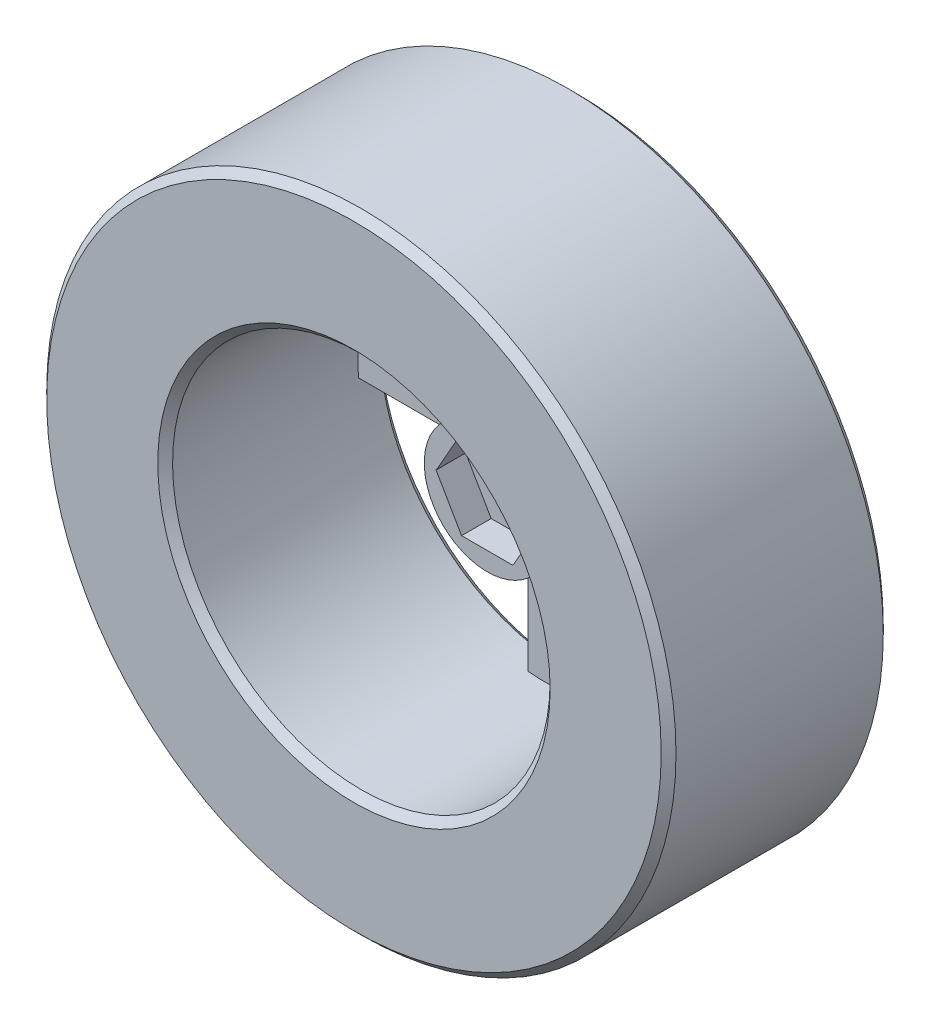
ISO-10303-21;
HEADER;
FILE_DESCRIPTION(('STEP AP214'),'2;1');
FILE_NAME('part.step','',(''),(''),'','','');
FILE_SCHEMA(('AUTOMOTIVE_DESIGN { 1 0 10303 214 1 1 1 1 }'));
ENDSEC;
DATA;
#1=APPLICATION_CONTEXT('core data for automotive mechanical design processes');
#2=APPLICATION_PROTOCOL_DEFINITION('international standard','automotive_design',2000,#1);
#3=PRODUCT_CONTEXT('',#1,'mechanical');
#4=PRODUCT('Part','Part','',(#3));
#5=PRODUCT_RELATED_PRODUCT_CATEGORY('part','',(#4));
#6=PRODUCT_DEFINITION_FORMATION('','',#4);
#7=PRODUCT_DEFINITION_CONTEXT('part definition',#1,'design');
#8=PRODUCT_DEFINITION('design','',#6,#7);
#9=PRODUCT_DEFINITION_SHAPE('','',#8);
#10=(LENGTH_UNIT() NAMED_UNIT(*) SI_UNIT(.MILLI.,.METRE.));
#11=(NAMED_UNIT(*) PLANE_ANGLE_UNIT() SI_UNIT($,.RADIAN.));
#12=(NAMED_UNIT(*) SI_UNIT($,.STERADIAN.) SOLID_ANGLE_UNIT());
#13=UNCERTAINTY_MEASURE_WITH_UNIT(LENGTH_MEASURE(1.E-05),#10,'distance_accuracy_value','');
#14=(GEOMETRIC_REPRESENTATION_CONTEXT(3) GLOBAL_UNCERTAINTY_ASSIGNED_CONTEXT((#13)) GLOBAL_UNIT_ASSIGNED_CONTEXT((#10,
#11,#12)) REPRESENTATION_CONTEXT('',''));
#15=CARTESIAN_POINT('',(0.,0.,0.));
#16=DIRECTION('',(0.,0.,1.));
#17=DIRECTION('',(1.,0.,0.));
#18=AXIS2_PLACEMENT_3D('',#15,#16,#17);
#19=CARTESIAN_POINT('',(0.,0.,0.));
#20=DIRECTION('',(0.,0.,1.));
#21=DIRECTION('',(1.,0.,0.));
#22=AXIS2_PLACEMENT_3D('',#19,#20,#21);
#23=PLANE('',#22);
#24=CARTESIAN_POINT('',(0.,0.,0.));
#25=DIRECTION('',(0.,0.,1.));
#26=DIRECTION('',(1.,0.,0.));
#27=AXIS2_PLACEMENT_3D('',#24,#25,#26);
#28=CIRCLE('',#27,41.5);
#29=CARTESIAN_POINT('',(41.5,0.,0.));
#30=VERTEX_POINT('',#29);
#31=EDGE_CURVE('E11',#30,#30,#28,.F.);
#32=ORIENTED_EDGE('',*,*,#31,.T.);
#33=EDGE_LOOP('',(#32));
#34=FACE_BOUND('',#33,.T.);
#35=CARTESIAN_POINT('',(0.,0.,0.));
#36=DIRECTION('',(0.,0.,1.));
#37=DIRECTION('',(1.,0.,0.));
#38=AXIS2_PLACEMENT_3D('',#35,#36,#37);
#39=CIRCLE('',#38,26.5);
#40=CARTESIAN_POINT('',(-26.3818119165458,-2.49999999999999,0.));
#41=VERTEX_POINT('',#40);
#42=CARTESIAN_POINT('',(-2.49999999999998,-26.3818119165458,0.));
#43=VERTEX_POINT('',#42);
#44=EDGE_CURVE('E403',#41,#43,#39,.T.);
#45=ORIENTED_EDGE('',*,*,#44,.T.);
#46=DIRECTION('',(0.,-1.,0.));
#47=VECTOR('',#46,1.);
#48=CARTESIAN_POINT('',(-2.49999999999999,0.,0.));
#49=LINE('',#48,#47);
#50=CARTESIAN_POINT('',(-2.49999999999999,-8.12403840463596,0.));
#51=VERTEX_POINT('',#50);
#52=EDGE_CURVE('E313',#51,#43,#49,.T.);
#53=ORIENTED_EDGE('',*,*,#52,.F.);
#54=CARTESIAN_POINT('',(0.,0.,0.));
#55=DIRECTION('',(0.,0.,1.));
#56=DIRECTION('',(1.,0.,0.));
#57=AXIS2_PLACEMENT_3D('',#54,#55,#56);
#58=CIRCLE('',#57,8.5);
#59=CARTESIAN_POINT('',(-8.12403840463596,-2.49999999999999,0.));
#60=VERTEX_POINT('',#59);
#61=EDGE_CURVE('E601',#60,#51,#58,.T.);
#62=ORIENTED_EDGE('',*,*,#61,.F.);
#63=DIRECTION('',(-1.,0.,0.));
#64=VECTOR('',#63,1.);
#65=CARTESIAN_POINT('',(0.,-2.49999999999999,0.));
#66=LINE('',#65,#64);
#67=EDGE_CURVE('E292',#60,#41,#66,.T.);
#68=ORIENTED_EDGE('',*,*,#67,.T.);
#69=EDGE_LOOP('',(#45,#53,#62,#68));
#70=FACE_BOUND('',#69,.T.);
#71=CARTESIAN_POINT('',(0.,0.,0.));
#72=DIRECTION('',(0.,0.,1.));
#73=DIRECTION('',(1.,0.,0.));
#74=AXIS2_PLACEMENT_3D('',#71,#72,#73);
#75=CIRCLE('',#74,26.5);
#76=CARTESIAN_POINT('',(2.5,-26.3818119165458,0.));
#77=VERTEX_POINT('',#76);
#78=CARTESIAN_POINT('',(26.3818119165458,-2.49999999999999,0.));
#79=VERTEX_POINT('',#78);
#80=EDGE_CURVE('E406',#77,#79,#75,.T.);
#81=ORIENTED_EDGE('',*,*,#80,.T.);
#82=DIRECTION('',(-1.,0.,0.));
#83=VECTOR('',#82,1.);
#84=CARTESIAN_POINT('',(0.,-2.49999999999999,0.));
#85=LINE('',#84,#83);
#86=CARTESIAN_POINT('',(8.12403840463596,-2.49999999999999,0.));
#87=VERTEX_POINT('',#86);
#88=EDGE_CURVE('E337',#79,#87,#85,.T.);
#89=ORIENTED_EDGE('',*,*,#88,.T.);
#90=CARTESIAN_POINT('',(2.5,-8.12403840463596,0.));
#91=VERTEX_POINT('',#90);
#92=EDGE_CURVE('E272',#91,#87,#58,.T.);
#93=ORIENTED_EDGE('',*,*,#92,.F.);
#94=DIRECTION('',(0.,-1.,0.));
#95=VECTOR('',#94,1.);
#96=CARTESIAN_POINT('',(2.5,0.,0.));
#97=LINE('',#96,#95);
#98=EDGE_CURVE('E317',#91,#77,#97,.T.);
#99=ORIENTED_EDGE('',*,*,#98,.T.);
#100=EDGE_LOOP('',(#81,#89,#93,#99));
#101=FACE_BOUND('',#100,.T.);
#102=CARTESIAN_POINT('',(0.,0.,0.));
#103=DIRECTION('',(0.,0.,1.));
#104=DIRECTION('',(1.,0.,0.));
#105=AXIS2_PLACEMENT_3D('',#102,#103,#104);
#106=CIRCLE('',#105,26.5);
#107=CARTESIAN_POINT('',(26.3818119165458,2.5,0.));
#108=VERTEX_POINT('',#107);
#109=CARTESIAN_POINT('',(2.5,26.3818119165458,0.));
#110=VERTEX_POINT('',#109);
#111=EDGE_CURVE('E400',#108,#110,#106,.T.);
#112=ORIENTED_EDGE('',*,*,#111,.T.);
#113=DIRECTION('',(0.,-1.,0.));
#114=VECTOR('',#113,1.);
#115=CARTESIAN_POINT('',(2.5,0.,0.));
#116=LINE('',#115,#114);
#117=CARTESIAN_POINT('',(2.5,8.12403840463596,0.));
#118=VERTEX_POINT('',#117);
#119=EDGE_CURVE('E363',#110,#118,#116,.T.);
#120=ORIENTED_EDGE('',*,*,#119,.T.);
#121=CARTESIAN_POINT('',(8.12403840463596,2.5,0.));
#122=VERTEX_POINT('',#121);
#123=EDGE_CURVE('E286',#122,#118,#58,.T.);
#124=ORIENTED_EDGE('',*,*,#123,.F.);
#125=DIRECTION('',(1.,0.,0.));
#126=VECTOR('',#125,1.);
#127=CARTESIAN_POINT('',(0.,2.5,0.));
#128=LINE('',#127,#126);
#129=EDGE_CURVE('E341',#122,#108,#128,.T.);
#130=ORIENTED_EDGE('',*,*,#129,.T.);
#131=EDGE_LOOP('',(#112,#120,#124,#130));
#132=FACE_BOUND('',#131,.T.);
#133=CARTESIAN_POINT('',(0.,0.,0.));
#134=DIRECTION('',(0.,0.,1.));
#135=DIRECTION('',(1.,0.,0.));
#136=AXIS2_PLACEMENT_3D('',#133,#134,#135);
#137=CIRCLE('',#136,26.5);
#138=CARTESIAN_POINT('',(-2.49999999999999,26.3818119165458,0.));
#139=VERTEX_POINT('',#138);
#140=CARTESIAN_POINT('',(-26.3818119165458,2.5,0.));
#141=VERTEX_POINT('',#140);
#142=EDGE_CURVE('E397',#139,#141,#137,.T.);
#143=ORIENTED_EDGE('',*,*,#142,.T.);
#144=DIRECTION('',(1.,0.,0.));
#145=VECTOR('',#144,1.);
#146=CARTESIAN_POINT('',(0.,2.5,0.));
#147=LINE('',#146,#145);
#148=CARTESIAN_POINT('',(-8.12403840463596,2.5,0.));
#149=VERTEX_POINT('',#148);
#150=EDGE_CURVE('E285',#141,#149,#147,.T.);
#151=ORIENTED_EDGE('',*,*,#150,.T.);
#152=CARTESIAN_POINT('',(-2.49999999999999,8.12403840463596,0.));
#153=VERTEX_POINT('',#152);
#154=EDGE_CURVE('E288',#153,#149,#58,.T.);
#155=ORIENTED_EDGE('',*,*,#154,.F.);
#156=DIRECTION('',(0.,-1.,0.));
#157=VECTOR('',#156,1.);
#158=CARTESIAN_POINT('',(-2.49999999999999,0.,0.));
#159=LINE('',#158,#157);
#160=EDGE_CURVE('E368',#139,#153,#159,.T.);
#161=ORIENTED_EDGE('',*,*,#160,.F.);
#162=EDGE_LOOP('',(#143,#151,#155,#161));
#163=FACE_BOUND('',#162,.T.);
#164=ADVANCED_FACE('F34',(#34,#70,#101,#132,#163),#23,.F.);
#165=CARTESIAN_POINT('',(0.,0.,30.));
#166=DIRECTION('',(0.,0.,1.));
#167=DIRECTION('',(1.,0.,0.));
#168=AXIS2_PLACEMENT_3D('',#165,#166,#167);
#169=PLANE('',#168);
#170=CARTESIAN_POINT('',(0.,0.,30.));
#171=DIRECTION('',(0.,0.,1.));
#172=DIRECTION('',(1.,0.,0.));
#173=AXIS2_PLACEMENT_3D('',#170,#171,#172);
#174=CIRCLE('',#173,41.5);
#175=CARTESIAN_POINT('',(41.5,0.,30.));
#176=VERTEX_POINT('',#175);
#177=EDGE_CURVE('E42',#176,#176,#174,.T.);
#178=ORIENTED_EDGE('',*,*,#177,.T.);
#179=EDGE_LOOP('',(#178));
#180=FACE_BOUND('',#179,.T.);
#181=CARTESIAN_POINT('',(0.,0.,30.));
#182=DIRECTION('',(0.,0.,1.));
#183=DIRECTION('',(1.,0.,0.));
#184=AXIS2_PLACEMENT_3D('',#181,#182,#183);
#185=CIRCLE('',#184,26.5);
#186=CARTESIAN_POINT('',(26.5,0.,30.));
#187=VERTEX_POINT('',#186);
#188=EDGE_CURVE('E394',#187,#187,#185,.F.);
#189=ORIENTED_EDGE('',*,*,#188,.T.);
#190=EDGE_LOOP('',(#189));
#191=FACE_BOUND('',#190,.T.);
#192=ADVANCED_FACE('F447',(#180,#191),#169,.T.);
#193=CARTESIAN_POINT('',(0.,0.,30.));
#194=DIRECTION('',(0.,0.,-1.));
#195=DIRECTION('',(-1.,0.,0.));
#196=AXIS2_PLACEMENT_3D('',#193,#194,#195);
#197=CYLINDRICAL_SURFACE('',#196,25.5);
#198=CARTESIAN_POINT('',(0.,0.,29.));
#199=DIRECTION('',(0.,0.,1.));
#200=DIRECTION('',(1.,0.,0.));
#201=AXIS2_PLACEMENT_3D('',#198,#199,#200);
#202=CIRCLE('',#201,25.5);
#203=CARTESIAN_POINT('',(25.5,0.,29.));
#204=VERTEX_POINT('',#203);
#205=EDGE_CURVE('E391',#204,#204,#202,.T.);
#206=ORIENTED_EDGE('',*,*,#205,.T.);
#207=EDGE_LOOP('',(#206));
#208=FACE_BOUND('',#207,.T.);
#209=DIRECTION('',(0.,0.,-1.));
#210=VECTOR('',#209,1.);
#211=CARTESIAN_POINT('',(25.377155080899,-2.49999999999999,4.));
#212=LINE('',#211,#210);
#213=CARTESIAN_POINT('',(25.377155080899,-2.49999999999999,4.));
#214=VERTEX_POINT('',#213);
#215=CARTESIAN_POINT('',(25.377155080899,-2.49999999999999,1.));
#216=VERTEX_POINT('',#215);
#217=EDGE_CURVE('E360',#214,#216,#212,.T.);
#218=ORIENTED_EDGE('',*,*,#217,.T.);
#219=CARTESIAN_POINT('',(0.,0.,1.));
#220=DIRECTION('',(0.,0.,1.));
#221=DIRECTION('',(1.,0.,0.));
#222=AXIS2_PLACEMENT_3D('',#219,#220,#221);
#223=CIRCLE('',#222,25.5);
#224=CARTESIAN_POINT('',(2.5,-25.377155080899,1.));
#225=VERTEX_POINT('',#224);
#226=EDGE_CURVE('E414',#216,#225,#223,.F.);
#227=ORIENTED_EDGE('',*,*,#226,.T.);
#228=DIRECTION('',(0.,0.,-1.));
#229=VECTOR('',#228,1.);
#230=CARTESIAN_POINT('',(2.5,-25.377155080899,4.));
#231=LINE('',#230,#229);
#232=CARTESIAN_POINT('',(2.5,-25.377155080899,4.));
#233=VERTEX_POINT('',#232);
#234=EDGE_CURVE('E332',#233,#225,#231,.T.);
#235=ORIENTED_EDGE('',*,*,#234,.F.);
#236=CARTESIAN_POINT('',(0.,0.,4.));
#237=DIRECTION('',(0.,0.,1.));
#238=DIRECTION('',(1.,0.,0.));
#239=AXIS2_PLACEMENT_3D('',#236,#237,#238);
#240=CIRCLE('',#239,25.5);
#241=CARTESIAN_POINT('',(-2.49999999999998,-25.377155080899,4.));
#242=VERTEX_POINT('',#241);
#243=EDGE_CURVE('E316',#242,#233,#240,.T.);
#244=ORIENTED_EDGE('',*,*,#243,.F.);
#245=DIRECTION('',(0.,0.,-1.));
#246=VECTOR('',#245,1.);
#247=CARTESIAN_POINT('',(-2.49999999999998,-25.377155080899,4.));
#248=LINE('',#247,#246);
#249=CARTESIAN_POINT('',(-2.49999999999998,-25.377155080899,1.));
#250=VERTEX_POINT('',#249);
#251=EDGE_CURVE('E335',#242,#250,#248,.T.);
#252=ORIENTED_EDGE('',*,*,#251,.T.);
#253=CARTESIAN_POINT('',(0.,0.,1.));
#254=DIRECTION('',(0.,0.,1.));
#255=DIRECTION('',(1.,0.,0.));
#256=AXIS2_PLACEMENT_3D('',#253,#254,#255);
#257=CIRCLE('',#256,25.5);
#258=CARTESIAN_POINT('',(-25.377155080899,-2.49999999999999,1.));
#259=VERTEX_POINT('',#258);
#260=EDGE_CURVE('E49',#250,#259,#257,.F.);
#261=ORIENTED_EDGE('',*,*,#260,.T.);
#262=DIRECTION('',(0.,0.,-1.));
#263=VECTOR('',#262,1.);
#264=CARTESIAN_POINT('',(-25.377155080899,-2.49999999999999,4.));
#265=LINE('',#264,#263);
#266=CARTESIAN_POINT('',(-25.377155080899,-2.49999999999999,4.));
#267=VERTEX_POINT('',#266);
#268=EDGE_CURVE('E308',#267,#259,#265,.T.);
#269=ORIENTED_EDGE('',*,*,#268,.F.);
#270=CARTESIAN_POINT('',(0.,0.,4.));
#271=DIRECTION('',(0.,0.,1.));
#272=DIRECTION('',(1.,0.,0.));
#273=AXIS2_PLACEMENT_3D('',#270,#271,#272);
#274=CIRCLE('',#273,25.5);
#275=CARTESIAN_POINT('',(-25.377155080899,2.5,4.));
#276=VERTEX_POINT('',#275);
#277=EDGE_CURVE('E291',#276,#267,#274,.T.);
#278=ORIENTED_EDGE('',*,*,#277,.F.);
#279=DIRECTION('',(0.,0.,-1.));
#280=VECTOR('',#279,1.);
#281=CARTESIAN_POINT('',(-25.377155080899,2.5,4.));
#282=LINE('',#281,#280);
#283=CARTESIAN_POINT('',(-25.377155080899,2.5,1.));
#284=VERTEX_POINT('',#283);
#285=EDGE_CURVE('E310',#276,#284,#282,.T.);
#286=ORIENTED_EDGE('',*,*,#285,.T.);
#287=CARTESIAN_POINT('',(0.,0.,1.));
#288=DIRECTION('',(0.,0.,1.));
#289=DIRECTION('',(1.,0.,0.));
#290=AXIS2_PLACEMENT_3D('',#287,#288,#289);
#291=CIRCLE('',#290,25.5);
#292=CARTESIAN_POINT('',(-2.49999999999999,25.377155080899,1.));
#293=VERTEX_POINT('',#292);
#294=EDGE_CURVE('E409',#284,#293,#291,.F.);
#295=ORIENTED_EDGE('',*,*,#294,.T.);
#296=DIRECTION('',(0.,0.,-1.));
#297=VECTOR('',#296,1.);
#298=CARTESIAN_POINT('',(-2.49999999999999,25.377155080899,4.));
#299=LINE('',#298,#297);
#300=CARTESIAN_POINT('',(-2.49999999999999,25.377155080899,4.));
#301=VERTEX_POINT('',#300);
#302=EDGE_CURVE('E385',#301,#293,#299,.T.);
#303=ORIENTED_EDGE('',*,*,#302,.F.);
#304=CARTESIAN_POINT('',(0.,0.,4.));
#305=DIRECTION('',(0.,0.,1.));
#306=DIRECTION('',(1.,0.,0.));
#307=AXIS2_PLACEMENT_3D('',#304,#305,#306);
#308=CIRCLE('',#307,25.5);
#309=CARTESIAN_POINT('',(2.5,25.377155080899,4.));
#310=VERTEX_POINT('',#309);
#311=EDGE_CURVE('E367',#310,#301,#308,.T.);
#312=ORIENTED_EDGE('',*,*,#311,.F.);
#313=DIRECTION('',(0.,0.,-1.));
#314=VECTOR('',#313,1.);
#315=CARTESIAN_POINT('',(2.5,25.377155080899,4.));
#316=LINE('',#315,#314);
#317=CARTESIAN_POINT('',(2.5,25.377155080899,1.));
#318=VERTEX_POINT('',#317);
#319=EDGE_CURVE('E388',#310,#318,#316,.T.);
#320=ORIENTED_EDGE('',*,*,#319,.T.);
#321=CARTESIAN_POINT('',(0.,0.,1.));
#322=DIRECTION('',(0.,0.,1.));
#323=DIRECTION('',(1.,0.,0.));
#324=AXIS2_PLACEMENT_3D('',#321,#322,#323);
#325=CIRCLE('',#324,25.5);
#326=CARTESIAN_POINT('',(25.377155080899,2.5,1.));
#327=VERTEX_POINT('',#326);
#328=EDGE_CURVE('E411',#318,#327,#325,.F.);
#329=ORIENTED_EDGE('',*,*,#328,.T.);
#330=DIRECTION('',(0.,0.,-1.));
#331=VECTOR('',#330,1.);
#332=CARTESIAN_POINT('',(25.377155080899,2.5,4.));
#333=LINE('',#332,#331);
#334=CARTESIAN_POINT('',(25.377155080899,2.5,4.));
#335=VERTEX_POINT('',#334);
#336=EDGE_CURVE('E357',#335,#327,#333,.T.);
#337=ORIENTED_EDGE('',*,*,#336,.F.);
#338=CARTESIAN_POINT('',(0.,0.,4.));
#339=DIRECTION('',(0.,0.,1.));
#340=DIRECTION('',(1.,0.,0.));
#341=AXIS2_PLACEMENT_3D('',#338,#339,#340);
#342=CIRCLE('',#341,25.5);
#343=EDGE_CURVE('E340',#214,#335,#342,.T.);
#344=ORIENTED_EDGE('',*,*,#343,.F.);
#345=EDGE_LOOP('',(#218,#227,#235,#244,#252,#261,#269,#278,#286,#295,#303,#312,#320,#329,#337,#344));
#346=FACE_BOUND('',#345,.T.);
#347=ADVANCED_FACE('F443',(#208,#346),#197,.F.);
#348=CARTESIAN_POINT('',(2.5,0.,4.));
#349=DIRECTION('',(1.,0.,0.));
#350=DIRECTION('',(0.,1.,0.));
#351=AXIS2_PLACEMENT_3D('',#348,#349,#350);
#352=PLANE('',#351);
#353=ORIENTED_EDGE('',*,*,#119,.F.);
#354=CARTESIAN_POINT('',(2.5,26.3818119165458,0.));
#355=CARTESIAN_POINT('',(2.5,26.2143840709584,0.166681696675359));
#356=CARTESIAN_POINT('',(2.5,26.0469487451974,0.333355878343144));
#357=CARTESIAN_POINT('',(2.5,25.7120631333152,0.66668921167648));
#358=CARTESIAN_POINT('',(2.5,25.5446128471939,0.83334836334203));
#359=CARTESIAN_POINT('',(2.5,25.377155080899,1.));
#360=B_SPLINE_CURVE_WITH_KNOTS('',3,(#354,#355,#356,#357,#358,#359),.UNSPECIFIED.,.F.,.F.,(4,2,
4),(0.,0.708755134250108,1.41751026855513),.UNSPECIFIED.);
#361=EDGE_CURVE('E530',#110,#318,#360,.T.);
#362=ORIENTED_EDGE('',*,*,#361,.T.);
#363=ORIENTED_EDGE('',*,*,#319,.F.);
#364=DIRECTION('',(0.,-1.,0.));
#365=VECTOR('',#364,1.);
#366=CARTESIAN_POINT('',(2.5,0.,4.));
#367=LINE('',#366,#365);
#368=CARTESIAN_POINT('',(2.5,8.12403840463596,4.));
#369=VERTEX_POINT('',#368);
#370=EDGE_CURVE('E364',#310,#369,#367,.T.);
#371=ORIENTED_EDGE('',*,*,#370,.T.);
#372=DIRECTION('',(0.,0.,-1.));
#373=VECTOR('',#372,1.);
#374=CARTESIAN_POINT('',(2.5,8.12403840463596,4.));
#375=LINE('',#374,#373);
#376=EDGE_CURVE('E375',#369,#118,#375,.T.);
#377=ORIENTED_EDGE('',*,*,#376,.T.);
#378=EDGE_LOOP('',(#353,#362,#363,#371,#377));
#379=FACE_BOUND('',#378,.T.);
#380=ADVANCED_FACE('F446',(#379),#352,.T.);
#381=CARTESIAN_POINT('',(-2.49999999999999,0.,4.));
#382=DIRECTION('',(1.,0.,0.));
#383=DIRECTION('',(0.,1.,0.));
#384=AXIS2_PLACEMENT_3D('',#381,#382,#383);
#385=PLANE('',#384);
#386=ORIENTED_EDGE('',*,*,#160,.T.);
#387=DIRECTION('',(0.,0.,-1.));
#388=VECTOR('',#387,1.);
#389=CARTESIAN_POINT('',(-2.49999999999999,8.12403840463596,4.));
#390=LINE('',#389,#388);
#391=CARTESIAN_POINT('',(-2.49999999999999,8.12403840463596,4.));
#392=VERTEX_POINT('',#391);
#393=EDGE_CURVE('E382',#392,#153,#390,.T.);
#394=ORIENTED_EDGE('',*,*,#393,.F.);
#395=DIRECTION('',(0.,-1.,0.));
#396=VECTOR('',#395,1.);
#397=CARTESIAN_POINT('',(-2.49999999999999,0.,4.));
#398=LINE('',#397,#396);
#399=EDGE_CURVE('E370',#301,#392,#398,.T.);
#400=ORIENTED_EDGE('',*,*,#399,.F.);
#401=ORIENTED_EDGE('',*,*,#302,.T.);
#402=CARTESIAN_POINT('',(-2.49999999999999,25.377155080899,1.));
#403=CARTESIAN_POINT('',(-2.49999999999999,25.5446128471939,0.833348363342029));
#404=CARTESIAN_POINT('',(-2.49999999999999,25.7120631333152,0.666689211676479));
#405=CARTESIAN_POINT('',(-2.49999999999999,26.0469487451974,0.333355878343143));
#406=CARTESIAN_POINT('',(-2.49999999999999,26.2143840709584,0.166681696675358));
#407=CARTESIAN_POINT('',(-2.49999999999999,26.3818119165458,0.));
#408=B_SPLINE_CURVE_WITH_KNOTS('',3,(#402,#403,#404,#405,#406,#407),.UNSPECIFIED.,.F.,.F.,(4,2,
4),(0.,0.708755134305022,1.41751026855513),.UNSPECIFIED.);
#409=EDGE_CURVE('E465',#293,#139,#408,.T.);
#410=ORIENTED_EDGE('',*,*,#409,.T.);
#411=EDGE_LOOP('',(#386,#394,#400,#401,#410));
#412=FACE_BOUND('',#411,.T.);
#413=ADVANCED_FACE('F454',(#412),#385,.F.);
#414=CARTESIAN_POINT('',(0.,0.,4.));
#415=DIRECTION('',(0.,0.,1.));
#416=DIRECTION('',(1.,0.,0.));
#417=AXIS2_PLACEMENT_3D('',#414,#415,#416);
#418=PLANE('',#417);
#419=ORIENTED_EDGE('',*,*,#370,.F.);
#420=ORIENTED_EDGE('',*,*,#311,.T.);
#421=ORIENTED_EDGE('',*,*,#399,.T.);
#422=CARTESIAN_POINT('',(0.,0.,4.));
#423=DIRECTION('',(0.,0.,1.));
#424=DIRECTION('',(1.,0.,0.));
#425=AXIS2_PLACEMENT_3D('',#422,#423,#424);
#426=CIRCLE('',#425,8.5);
#427=EDGE_CURVE('E373',#369,#392,#426,.T.);
#428=ORIENTED_EDGE('',*,*,#427,.F.);
#429=EDGE_LOOP('',(#419,#420,#421,#428));
#430=FACE_BOUND('',#429,.T.);
#431=ADVANCED_FACE('F439',(#430),#418,.T.);
#432=CARTESIAN_POINT('',(0.,-2.49999999999999,4.));
#433=DIRECTION('',(0.,-1.,0.));
#434=DIRECTION('',(1.,0.,0.));
#435=AXIS2_PLACEMENT_3D('',#432,#433,#434);
#436=PLANE('',#435);
#437=ORIENTED_EDGE('',*,*,#88,.F.);
#438=CARTESIAN_POINT('',(26.3818119165458,-2.49999999999999,0.));
#439=CARTESIAN_POINT('',(26.2143840709585,-2.49999999999999,0.166681696675359));
#440=CARTESIAN_POINT('',(26.0469487451974,-2.49999999999999,0.333355878343144));
#441=CARTESIAN_POINT('',(25.7120631333152,-2.49999999999999,0.66668921167648));
#442=CARTESIAN_POINT('',(25.5446128471939,-2.49999999999999,0.83334836334203));
#443=CARTESIAN_POINT('',(25.377155080899,-2.49999999999999,1.));
#444=B_SPLINE_CURVE_WITH_KNOTS('',3,(#438,#439,#440,#441,#442,#443),.UNSPECIFIED.,.F.,.F.,(4,2,
4),(0.,0.708755134250114,1.41751026855514),.UNSPECIFIED.);
#445=EDGE_CURVE('E416',#79,#216,#444,.T.);
#446=ORIENTED_EDGE('',*,*,#445,.T.);
#447=ORIENTED_EDGE('',*,*,#217,.F.);
#448=DIRECTION('',(-1.,0.,0.));
#449=VECTOR('',#448,1.);
#450=CARTESIAN_POINT('',(0.,-2.49999999999999,4.));
#451=LINE('',#450,#449);
#452=CARTESIAN_POINT('',(8.12403840463596,-2.49999999999999,4.));
#453=VERTEX_POINT('',#452);
#454=EDGE_CURVE('E338',#214,#453,#451,.T.);
#455=ORIENTED_EDGE('',*,*,#454,.T.);
#456=DIRECTION('',(0.,0.,-1.));
#457=VECTOR('',#456,1.);
#458=CARTESIAN_POINT('',(8.12403840463596,-2.49999999999999,4.));
#459=LINE('',#458,#457);
#460=EDGE_CURVE('E349',#453,#87,#459,.T.);
#461=ORIENTED_EDGE('',*,*,#460,.T.);
#462=EDGE_LOOP('',(#437,#446,#447,#455,#461));
#463=FACE_BOUND('',#462,.T.);
#464=ADVANCED_FACE('F433',(#463),#436,.T.);
#465=CARTESIAN_POINT('',(0.,2.5,4.));
#466=DIRECTION('',(0.,1.,0.));
#467=DIRECTION('',(-1.,0.,0.));
#468=AXIS2_PLACEMENT_3D('',#465,#466,#467);
#469=PLANE('',#468);
#470=ORIENTED_EDGE('',*,*,#129,.F.);
#471=DIRECTION('',(0.,0.,-1.));
#472=VECTOR('',#471,1.);
#473=CARTESIAN_POINT('',(8.12403840463596,2.5,4.));
#474=LINE('',#473,#472);
#475=CARTESIAN_POINT('',(8.12403840463596,2.5,4.));
#476=VERTEX_POINT('',#475);
#477=EDGE_CURVE('E354',#476,#122,#474,.T.);
#478=ORIENTED_EDGE('',*,*,#477,.F.);
#479=DIRECTION('',(1.,0.,0.));
#480=VECTOR('',#479,1.);
#481=CARTESIAN_POINT('',(0.,2.5,4.));
#482=LINE('',#481,#480);
#483=EDGE_CURVE('E343',#476,#335,#482,.T.);
#484=ORIENTED_EDGE('',*,*,#483,.T.);
#485=ORIENTED_EDGE('',*,*,#336,.T.);
#486=CARTESIAN_POINT('',(25.377155080899,2.5,1.));
#487=CARTESIAN_POINT('',(25.5446128471939,2.5,0.833348363342029));
#488=CARTESIAN_POINT('',(25.7120631333152,2.5,0.666689211676479));
#489=CARTESIAN_POINT('',(26.0469487451974,2.5,0.333355878343143));
#490=CARTESIAN_POINT('',(26.2143840709584,2.5,0.166681696675358));
#491=CARTESIAN_POINT('',(26.3818119165458,2.5,0.));
#492=B_SPLINE_CURVE_WITH_KNOTS('',3,(#486,#487,#488,#489,#490,#491),.UNSPECIFIED.,.F.,.F.,(4,2,
4),(0.,0.708755134305022,1.41751026855513),.UNSPECIFIED.);
#493=EDGE_CURVE('E569',#327,#108,#492,.T.);
#494=ORIENTED_EDGE('',*,*,#493,.T.);
#495=EDGE_LOOP('',(#470,#478,#484,#485,#494));
#496=FACE_BOUND('',#495,.T.);
#497=ADVANCED_FACE('F438',(#496),#469,.T.);
#498=CARTESIAN_POINT('',(0.,0.,4.));
#499=DIRECTION('',(0.,0.,1.));
#500=DIRECTION('',(1.,0.,0.));
#501=AXIS2_PLACEMENT_3D('',#498,#499,#500);
#502=PLANE('',#501);
#503=ORIENTED_EDGE('',*,*,#454,.F.);
#504=ORIENTED_EDGE('',*,*,#343,.T.);
#505=ORIENTED_EDGE('',*,*,#483,.F.);
#506=CARTESIAN_POINT('',(0.,0.,4.));
#507=DIRECTION('',(0.,0.,1.));
#508=DIRECTION('',(1.,0.,0.));
#509=AXIS2_PLACEMENT_3D('',#506,#507,#508);
#510=CIRCLE('',#509,8.5);
#511=EDGE_CURVE('E346',#453,#476,#510,.T.);
#512=ORIENTED_EDGE('',*,*,#511,.F.);
#513=EDGE_LOOP('',(#503,#504,#505,#512));
#514=FACE_BOUND('',#513,.T.);
#515=ADVANCED_FACE('F597',(#514),#502,.T.);
#516=CARTESIAN_POINT('',(-2.49999999999999,0.,4.));
#517=DIRECTION('',(1.,0.,0.));
#518=DIRECTION('',(0.,1.,0.));
#519=AXIS2_PLACEMENT_3D('',#516,#517,#518);
#520=PLANE('',#519);
#521=ORIENTED_EDGE('',*,*,#52,.T.);
#522=CARTESIAN_POINT('',(-2.49999999999998,-26.3818119165458,0.));
#523=CARTESIAN_POINT('',(-2.49999999999998,-26.2143840709584,0.166681696675359));
#524=CARTESIAN_POINT('',(-2.49999999999998,-26.0469487451974,0.333355878343144));
#525=CARTESIAN_POINT('',(-2.49999999999998,-25.7120631333152,0.66668921167648));
#526=CARTESIAN_POINT('',(-2.49999999999998,-25.5446128471939,0.83334836334203));
#527=CARTESIAN_POINT('',(-2.49999999999998,-25.377155080899,1.));
#528=B_SPLINE_CURVE_WITH_KNOTS('',3,(#522,#523,#524,#525,#526,#527),.UNSPECIFIED.,.F.,.F.,(4,2,
4),(0.,0.708755134250108,1.41751026855513),.UNSPECIFIED.);
#529=EDGE_CURVE('E57',#43,#250,#528,.T.);
#530=ORIENTED_EDGE('',*,*,#529,.T.);
#531=ORIENTED_EDGE('',*,*,#251,.F.);
#532=DIRECTION('',(0.,-1.,0.));
#533=VECTOR('',#532,1.);
#534=CARTESIAN_POINT('',(-2.49999999999999,0.,4.));
#535=LINE('',#534,#533);
#536=CARTESIAN_POINT('',(-2.49999999999999,-8.12403840463596,4.));
#537=VERTEX_POINT('',#536);
#538=EDGE_CURVE('E314',#537,#242,#535,.T.);
#539=ORIENTED_EDGE('',*,*,#538,.F.);
#540=DIRECTION('',(0.,0.,-1.));
#541=VECTOR('',#540,1.);
#542=CARTESIAN_POINT('',(-2.49999999999999,-8.12403840463596,4.));
#543=LINE('',#542,#541);
#544=EDGE_CURVE('E325',#537,#51,#543,.T.);
#545=ORIENTED_EDGE('',*,*,#544,.T.);
#546=EDGE_LOOP('',(#521,#530,#531,#539,#545));
#547=FACE_BOUND('',#546,.T.);
#548=ADVANCED_FACE('F541',(#547),#520,.F.);
#549=CARTESIAN_POINT('',(2.5,0.,4.));
#550=DIRECTION('',(1.,0.,0.));
#551=DIRECTION('',(0.,0.,-1.));
#552=AXIS2_PLACEMENT_3D('',#549,#550,#551);
#553=PLANE('',#552);
#554=ORIENTED_EDGE('',*,*,#98,.F.);
#555=DIRECTION('',(0.,0.,-1.));
#556=VECTOR('',#555,1.);
#557=CARTESIAN_POINT('',(2.5,-8.12403840463596,4.));
#558=LINE('',#557,#556);
#559=CARTESIAN_POINT('',(2.5,-8.12403840463596,4.));
#560=VERTEX_POINT('',#559);
#561=EDGE_CURVE('E329',#560,#91,#558,.T.);
#562=ORIENTED_EDGE('',*,*,#561,.F.);
#563=DIRECTION('',(0.,-1.,0.));
#564=VECTOR('',#563,1.);
#565=CARTESIAN_POINT('',(2.5,0.,4.));
#566=LINE('',#565,#564);
#567=EDGE_CURVE('E319',#560,#233,#566,.T.);
#568=ORIENTED_EDGE('',*,*,#567,.T.);
#569=ORIENTED_EDGE('',*,*,#234,.T.);
#570=CARTESIAN_POINT('',(2.5,-25.377155080899,1.));
#571=CARTESIAN_POINT('',(2.5,-25.5446128471939,0.83334836334203));
#572=CARTESIAN_POINT('',(2.5,-25.7120631333152,0.66668921167648));
#573=CARTESIAN_POINT('',(2.5,-26.0469487451974,0.333355878343144));
#574=CARTESIAN_POINT('',(2.5,-26.2143840709585,0.166681696675359));
#575=CARTESIAN_POINT('',(2.5,-26.3818119165458,0.));
#576=B_SPLINE_CURVE_WITH_KNOTS('',3,(#570,#571,#572,#573,#574,#575),.UNSPECIFIED.,.F.,.F.,(4,2,
4),(0.,0.708755134305021,1.41751026855514),.UNSPECIFIED.);
#577=EDGE_CURVE('E423',#225,#77,#576,.T.);
#578=ORIENTED_EDGE('',*,*,#577,.T.);
#579=EDGE_LOOP('',(#554,#562,#568,#569,#578));
#580=FACE_BOUND('',#579,.T.);
#581=ADVANCED_FACE('F616',(#580),#553,.T.);
#582=CARTESIAN_POINT('',(0.,0.,4.));
#583=DIRECTION('',(0.,0.,1.));
#584=DIRECTION('',(1.,0.,0.));
#585=AXIS2_PLACEMENT_3D('',#582,#583,#584);
#586=PLANE('',#585);
#587=ORIENTED_EDGE('',*,*,#538,.T.);
#588=ORIENTED_EDGE('',*,*,#243,.T.);
#589=ORIENTED_EDGE('',*,*,#567,.F.);
#590=CARTESIAN_POINT('',(0.,0.,4.));
#591=DIRECTION('',(0.,0.,1.));
#592=DIRECTION('',(1.,0.,0.));
#593=AXIS2_PLACEMENT_3D('',#590,#591,#592);
#594=CIRCLE('',#593,8.5);
#595=EDGE_CURVE('E322',#537,#560,#594,.T.);
#596=ORIENTED_EDGE('',*,*,#595,.F.);
#597=EDGE_LOOP('',(#587,#588,#589,#596));
#598=FACE_BOUND('',#597,.T.);
#599=ADVANCED_FACE('F614',(#598),#586,.T.);
#600=CARTESIAN_POINT('',(0.,2.5,4.));
#601=DIRECTION('',(0.,1.,0.));
#602=DIRECTION('',(-1.,0.,0.));
#603=AXIS2_PLACEMENT_3D('',#600,#601,#602);
#604=PLANE('',#603);
#605=ORIENTED_EDGE('',*,*,#150,.F.);
#606=CARTESIAN_POINT('',(-26.3818119165458,2.5,0.));
#607=CARTESIAN_POINT('',(-26.2143840709584,2.5,0.166681696675359));
#608=CARTESIAN_POINT('',(-26.0469487451974,2.5,0.333355878343144));
#609=CARTESIAN_POINT('',(-25.7120631333152,2.5,0.66668921167648));
#610=CARTESIAN_POINT('',(-25.5446128471939,2.5,0.83334836334203));
#611=CARTESIAN_POINT('',(-25.377155080899,2.5,1.));
#612=B_SPLINE_CURVE_WITH_KNOTS('',3,(#606,#607,#608,#609,#610,#611),.UNSPECIFIED.,.F.,.F.,(4,2,
4),(0.,0.708755134250108,1.41751026855513),.UNSPECIFIED.);
#613=EDGE_CURVE('E474',#141,#284,#612,.T.);
#614=ORIENTED_EDGE('',*,*,#613,.T.);
#615=ORIENTED_EDGE('',*,*,#285,.F.);
#616=DIRECTION('',(1.,0.,0.));
#617=VECTOR('',#616,1.);
#618=CARTESIAN_POINT('',(0.,2.5,4.));
#619=LINE('',#618,#617);
#620=CARTESIAN_POINT('',(-8.12403840463596,2.5,4.));
#621=VERTEX_POINT('',#620);
#622=EDGE_CURVE('E289',#276,#621,#619,.T.);
#623=ORIENTED_EDGE('',*,*,#622,.T.);
#624=DIRECTION('',(0.,0.,-1.));
#625=VECTOR('',#624,1.);
#626=CARTESIAN_POINT('',(-8.12403840463596,2.5,4.));
#627=LINE('',#626,#625);
#628=EDGE_CURVE('E300',#621,#149,#627,.T.);
#629=ORIENTED_EDGE('',*,*,#628,.T.);
#630=EDGE_LOOP('',(#605,#614,#615,#623,#629));
#631=FACE_BOUND('',#630,.T.);
#632=ADVANCED_FACE('F566',(#631),#604,.T.);
#633=CARTESIAN_POINT('',(0.,-2.49999999999999,4.));
#634=DIRECTION('',(0.,-1.,0.));
#635=DIRECTION('',(1.,0.,0.));
#636=AXIS2_PLACEMENT_3D('',#633,#634,#635);
#637=PLANE('',#636);
#638=ORIENTED_EDGE('',*,*,#67,.F.);
#639=DIRECTION('',(0.,0.,-1.));
#640=VECTOR('',#639,1.);
#641=CARTESIAN_POINT('',(-8.12403840463596,-2.49999999999999,4.));
#642=LINE('',#641,#640);
#643=CARTESIAN_POINT('',(-8.12403840463597,-2.49999999999999,4.));
#644=VERTEX_POINT('',#643);
#645=EDGE_CURVE('E305',#644,#60,#642,.T.);
#646=ORIENTED_EDGE('',*,*,#645,.F.);
#647=DIRECTION('',(-1.,0.,0.));
#648=VECTOR('',#647,1.);
#649=CARTESIAN_POINT('',(0.,-2.49999999999999,4.));
#650=LINE('',#649,#648);
#651=EDGE_CURVE('E294',#644,#267,#650,.T.);
#652=ORIENTED_EDGE('',*,*,#651,.T.);
#653=ORIENTED_EDGE('',*,*,#268,.T.);
#654=CARTESIAN_POINT('',(-25.377155080899,-2.49999999999999,1.));
#655=CARTESIAN_POINT('',(-25.5446128471939,-2.49999999999999,0.833348363342029));
#656=CARTESIAN_POINT('',(-25.7120631333152,-2.49999999999999,0.666689211676479));
#657=CARTESIAN_POINT('',(-26.0469487451974,-2.49999999999999,0.333355878343143));
#658=CARTESIAN_POINT('',(-26.2143840709584,-2.49999999999999,0.166681696675358));
#659=CARTESIAN_POINT('',(-26.3818119165458,-2.49999999999999,0.));
#660=B_SPLINE_CURVE_WITH_KNOTS('',3,(#654,#655,#656,#657,#658,#659),.UNSPECIFIED.,.F.,.F.,(4,2,
4),(0.,0.708755134305022,1.41751026855513),.UNSPECIFIED.);
#661=EDGE_CURVE('E528',#259,#41,#660,.T.);
#662=ORIENTED_EDGE('',*,*,#661,.T.);
#663=EDGE_LOOP('',(#638,#646,#652,#653,#662));
#664=FACE_BOUND('',#663,.T.);
#665=ADVANCED_FACE('F556',(#664),#637,.T.);
#666=CARTESIAN_POINT('',(0.,0.,4.));
#667=DIRECTION('',(0.,0.,1.));
#668=DIRECTION('',(1.,0.,0.));
#669=AXIS2_PLACEMENT_3D('',#666,#667,#668);
#670=PLANE('',#669);
#671=ORIENTED_EDGE('',*,*,#622,.F.);
#672=ORIENTED_EDGE('',*,*,#277,.T.);
#673=ORIENTED_EDGE('',*,*,#651,.F.);
#674=CARTESIAN_POINT('',(0.,0.,4.));
#675=DIRECTION('',(0.,0.,1.));
#676=DIRECTION('',(1.,0.,0.));
#677=AXIS2_PLACEMENT_3D('',#674,#675,#676);
#678=CIRCLE('',#677,8.5);
#679=EDGE_CURVE('E297',#621,#644,#678,.T.);
#680=ORIENTED_EDGE('',*,*,#679,.F.);
#681=EDGE_LOOP('',(#671,#672,#673,#680));
#682=FACE_BOUND('',#681,.T.);
#683=ADVANCED_FACE('F562',(#682),#670,.T.);
#684=CARTESIAN_POINT('',(0.,0.,12.));
#685=DIRECTION('',(0.,0.,-1.));
#686=DIRECTION('',(-1.,0.,0.));
#687=AXIS2_PLACEMENT_3D('',#684,#685,#686);
#688=CYLINDRICAL_SURFACE('',#687,8.5);
#689=ORIENTED_EDGE('',*,*,#376,.F.);
#690=ORIENTED_EDGE('',*,*,#427,.T.);
#691=ORIENTED_EDGE('',*,*,#393,.T.);
#692=ORIENTED_EDGE('',*,*,#154,.T.);
#693=ORIENTED_EDGE('',*,*,#628,.F.);
#694=ORIENTED_EDGE('',*,*,#679,.T.);
#695=ORIENTED_EDGE('',*,*,#645,.T.);
#696=ORIENTED_EDGE('',*,*,#61,.T.);
#697=ORIENTED_EDGE('',*,*,#544,.F.);
#698=ORIENTED_EDGE('',*,*,#595,.T.);
#699=ORIENTED_EDGE('',*,*,#561,.T.);
#700=ORIENTED_EDGE('',*,*,#92,.T.);
#701=ORIENTED_EDGE('',*,*,#460,.F.);
#702=ORIENTED_EDGE('',*,*,#511,.T.);
#703=ORIENTED_EDGE('',*,*,#477,.T.);
#704=ORIENTED_EDGE('',*,*,#123,.T.);
#705=EDGE_LOOP('',(#689,#690,#691,#692,#693,#694,#695,#696,#697,#698,#699,#700,#701,#702,#703,#704));
#706=FACE_BOUND('',#705,.T.);
#707=CARTESIAN_POINT('',(0.,0.,12.));
#708=DIRECTION('',(0.,0.,1.));
#709=DIRECTION('',(1.,0.,0.));
#710=AXIS2_PLACEMENT_3D('',#707,#708,#709);
#711=CIRCLE('',#710,8.5);
#712=CARTESIAN_POINT('',(8.5,0.,12.));
#713=VERTEX_POINT('',#712);
#714=EDGE_CURVE('E282',#713,#713,#711,.T.);
#715=ORIENTED_EDGE('',*,*,#714,.F.);
#716=EDGE_LOOP('',(#715));
#717=FACE_BOUND('',#716,.T.);
#718=ADVANCED_FACE('F591',(#706,#717),#688,.T.);
#719=CARTESIAN_POINT('',(0.,0.,12.));
#720=DIRECTION('',(0.,0.,1.));
#721=DIRECTION('',(1.,0.,0.));
#722=AXIS2_PLACEMENT_3D('',#719,#720,#721);
#723=PLANE('',#722);
#724=DIRECTION('',(-0.500000000000001,0.866025403784438,0.));
#725=VECTOR('',#724,1.);
#726=CARTESIAN_POINT('',(3.46499999999998,6.00155604822617,12.));
#727=LINE('',#726,#725);
#728=CARTESIAN_POINT('',(6.93,0.,12.));
#729=VERTEX_POINT('',#728);
#730=CARTESIAN_POINT('',(3.46499999999998,6.00155604822617,12.));
#731=VERTEX_POINT('',#730);
#732=EDGE_CURVE('E222',#729,#731,#727,.T.);
#733=ORIENTED_EDGE('',*,*,#732,.F.);
#734=DIRECTION('',(0.5,0.866025403784438,0.));
#735=VECTOR('',#734,1.);
#736=CARTESIAN_POINT('',(6.93,0.,12.));
#737=LINE('',#736,#735);
#738=CARTESIAN_POINT('',(3.465,-6.00155604822616,12.));
#739=VERTEX_POINT('',#738);
#740=EDGE_CURVE('E240',#739,#729,#737,.T.);
#741=ORIENTED_EDGE('',*,*,#740,.F.);
#742=DIRECTION('',(1.,0.,0.));
#743=VECTOR('',#742,1.);
#744=CARTESIAN_POINT('',(3.465,-6.00155604822616,12.));
#745=LINE('',#744,#743);
#746=CARTESIAN_POINT('',(-3.46499999999999,-6.00155604822612,12.));
#747=VERTEX_POINT('',#746);
#748=EDGE_CURVE('E243',#747,#739,#745,.T.);
#749=ORIENTED_EDGE('',*,*,#748,.F.);
#750=DIRECTION('',(0.500000000000003,-0.866025403784437,0.));
#751=VECTOR('',#750,1.);
#752=CARTESIAN_POINT('',(-3.46499999999999,-6.00155604822612,12.));
#753=LINE('',#752,#751);
#754=CARTESIAN_POINT('',(-6.93,0.,12.));
#755=VERTEX_POINT('',#754);
#756=EDGE_CURVE('E265',#755,#747,#753,.T.);
#757=ORIENTED_EDGE('',*,*,#756,.F.);
#758=DIRECTION('',(-0.970382350895379,-0.241574197858046,0.));
#759=VECTOR('',#758,1.);
#760=CARTESIAN_POINT('',(-6.93,0.,12.));
#761=LINE('',#760,#759);
#762=CARTESIAN_POINT('',(-6.84137349151115,0.0220633420191518,12.));
#763=VERTEX_POINT('',#762);
#764=EDGE_CURVE('E262',#763,#755,#761,.T.);
#765=ORIENTED_EDGE('',*,*,#764,.F.);
#766=DIRECTION('',(-0.491688610793962,-0.870771100815538,0.));
#767=VECTOR('',#766,1.);
#768=CARTESIAN_POINT('',(-6.84137349151115,0.0220633420191518,12.));
#769=LINE('',#768,#767);
#770=CARTESIAN_POINT('',(-3.46500000000003,6.00155604822614,12.));
#771=VERTEX_POINT('',#770);
#772=EDGE_CURVE('E259',#771,#763,#769,.T.);
#773=ORIENTED_EDGE('',*,*,#772,.F.);
#774=DIRECTION('',(-1.,0.,0.));
#775=VECTOR('',#774,1.);
#776=CARTESIAN_POINT('',(-3.46500000000003,6.00155604822614,12.));
#777=LINE('',#776,#775);
#778=EDGE_CURVE('E257',#731,#771,#777,.T.);
#779=ORIENTED_EDGE('',*,*,#778,.F.);
#780=EDGE_LOOP('',(#733,#741,#749,#757,#765,#773,#779));
#781=FACE_BOUND('',#780,.T.);
#782=ORIENTED_EDGE('',*,*,#714,.T.);
#783=EDGE_LOOP('',(#782));
#784=FACE_BOUND('',#783,.T.);
#785=ADVANCED_FACE('F633',(#781,#784),#723,.T.);
#786=CARTESIAN_POINT('',(3.46499999999998,6.00155604822617,8.));
#787=DIRECTION('',(0.866025403784438,0.500000000000001,0.));
#788=DIRECTION('',(-0.500000000000001,0.866025403784438,0.));
#789=AXIS2_PLACEMENT_3D('',#786,#787,#788);
#790=PLANE('',#789);
#791=ORIENTED_EDGE('',*,*,#732,.T.);
#792=DIRECTION('',(0.,0.,1.));
#793=VECTOR('',#792,1.);
#794=CARTESIAN_POINT('',(3.46499999999998,6.00155604822617,8.));
#795=LINE('',#794,#793);
#796=CARTESIAN_POINT('',(3.46499999999998,6.00155604822617,8.));
#797=VERTEX_POINT('',#796);
#798=EDGE_CURVE('E215',#797,#731,#795,.T.);
#799=ORIENTED_EDGE('',*,*,#798,.F.);
#800=DIRECTION('',(-0.500000000000001,0.866025403784438,0.));
#801=VECTOR('',#800,1.);
#802=CARTESIAN_POINT('',(3.46499999999998,6.00155604822617,8.));
#803=LINE('',#802,#801);
#804=CARTESIAN_POINT('',(6.93,0.,8.));
#805=VERTEX_POINT('',#804);
#806=EDGE_CURVE('E219',#805,#797,#803,.T.);
#807=ORIENTED_EDGE('',*,*,#806,.F.);
#808=DIRECTION('',(0.,0.,1.));
#809=VECTOR('',#808,1.);
#810=CARTESIAN_POINT('',(6.93,0.,8.));
#811=LINE('',#810,#809);
#812=EDGE_CURVE('E270',#805,#729,#811,.T.);
#813=ORIENTED_EDGE('',*,*,#812,.T.);
#814=EDGE_LOOP('',(#791,#799,#807,#813));
#815=FACE_BOUND('',#814,.T.);
#816=ADVANCED_FACE('F217',(#815),#790,.F.);
#817=CARTESIAN_POINT('',(6.93,0.,8.));
#818=DIRECTION('',(0.866025403784439,-0.5,0.));
#819=DIRECTION('',(0.5,0.866025403784439,0.));
#820=AXIS2_PLACEMENT_3D('',#817,#818,#819);
#821=PLANE('',#820);
#822=ORIENTED_EDGE('',*,*,#740,.T.);
#823=ORIENTED_EDGE('',*,*,#812,.F.);
#824=DIRECTION('',(0.5,0.866025403784438,0.));
#825=VECTOR('',#824,1.);
#826=CARTESIAN_POINT('',(6.93,0.,8.));
#827=LINE('',#826,#825);
#828=CARTESIAN_POINT('',(3.465,-6.00155604822616,8.));
#829=VERTEX_POINT('',#828);
#830=EDGE_CURVE('E227',#829,#805,#827,.T.);
#831=ORIENTED_EDGE('',*,*,#830,.F.);
#832=DIRECTION('',(0.,0.,1.));
#833=VECTOR('',#832,1.);
#834=CARTESIAN_POINT('',(3.465,-6.00155604822616,8.));
#835=LINE('',#834,#833);
#836=EDGE_CURVE('E273',#829,#739,#835,.T.);
#837=ORIENTED_EDGE('',*,*,#836,.T.);
#838=EDGE_LOOP('',(#822,#823,#831,#837));
#839=FACE_BOUND('',#838,.T.);
#840=ADVANCED_FACE('F639',(#839),#821,.F.);
#841=CARTESIAN_POINT('',(3.465,-6.00155604822616,8.));
#842=DIRECTION('',(0.,-1.,0.));
#843=DIRECTION('',(1.,0.,0.));
#844=AXIS2_PLACEMENT_3D('',#841,#842,#843);
#845=PLANE('',#844);
#846=ORIENTED_EDGE('',*,*,#748,.T.);
#847=ORIENTED_EDGE('',*,*,#836,.F.);
#848=DIRECTION('',(1.,0.,0.));
#849=VECTOR('',#848,1.);
#850=CARTESIAN_POINT('',(3.465,-6.00155604822616,8.));
#851=LINE('',#850,#849);
#852=CARTESIAN_POINT('',(-3.46499999999999,-6.00155604822612,8.));
#853=VERTEX_POINT('',#852);
#854=EDGE_CURVE('E253',#853,#829,#851,.T.);
#855=ORIENTED_EDGE('',*,*,#854,.F.);
#856=DIRECTION('',(0.,0.,1.));
#857=VECTOR('',#856,1.);
#858=CARTESIAN_POINT('',(-3.46499999999999,-6.00155604822612,8.));
#859=LINE('',#858,#857);
#860=EDGE_CURVE('E275',#853,#747,#859,.T.);
#861=ORIENTED_EDGE('',*,*,#860,.T.);
#862=EDGE_LOOP('',(#846,#847,#855,#861));
#863=FACE_BOUND('',#862,.T.);
#864=ADVANCED_FACE('F653',(#863),#845,.F.);
#865=CARTESIAN_POINT('',(-3.46499999999999,-6.00155604822612,8.));
#866=DIRECTION('',(-0.866025403784437,-0.500000000000003,0.));
#867=DIRECTION('',(0.500000000000003,-0.866025403784437,0.));
#868=AXIS2_PLACEMENT_3D('',#865,#866,#867);
#869=PLANE('',#868);
#870=ORIENTED_EDGE('',*,*,#756,.T.);
#871=ORIENTED_EDGE('',*,*,#860,.F.);
#872=DIRECTION('',(0.500000000000003,-0.866025403784437,0.));
#873=VECTOR('',#872,1.);
#874=CARTESIAN_POINT('',(-3.46499999999999,-6.00155604822612,8.));
#875=LINE('',#874,#873);
#876=CARTESIAN_POINT('',(-6.93,0.,8.));
#877=VERTEX_POINT('',#876);
#878=EDGE_CURVE('E250',#877,#853,#875,.T.);
#879=ORIENTED_EDGE('',*,*,#878,.F.);
#880=DIRECTION('',(0.,0.,1.));
#881=VECTOR('',#880,1.);
#882=CARTESIAN_POINT('',(-6.93,0.,8.));
#883=LINE('',#882,#881);
#884=EDGE_CURVE('E277',#877,#755,#883,.T.);
#885=ORIENTED_EDGE('',*,*,#884,.T.);
#886=EDGE_LOOP('',(#870,#871,#879,#885));
#887=FACE_BOUND('',#886,.T.);
#888=ADVANCED_FACE('F649',(#887),#869,.F.);
#889=CARTESIAN_POINT('',(-6.93,0.,8.));
#890=DIRECTION('',(-0.241574197858046,0.970382350895379,0.));
#891=DIRECTION('',(-0.970382350895379,-0.241574197858046,0.));
#892=AXIS2_PLACEMENT_3D('',#889,#890,#891);
#893=PLANE('',#892);
#894=ORIENTED_EDGE('',*,*,#764,.T.);
#895=ORIENTED_EDGE('',*,*,#884,.F.);
#896=DIRECTION('',(-0.970382350895379,-0.241574197858046,0.));
#897=VECTOR('',#896,1.);
#898=CARTESIAN_POINT('',(-6.93,0.,8.));
#899=LINE('',#898,#897);
#900=CARTESIAN_POINT('',(-6.84137349151115,0.0220633420191518,8.));
#901=VERTEX_POINT('',#900);
#902=EDGE_CURVE('E247',#901,#877,#899,.T.);
#903=ORIENTED_EDGE('',*,*,#902,.F.);
#904=DIRECTION('',(0.,0.,1.));
#905=VECTOR('',#904,1.);
#906=CARTESIAN_POINT('',(-6.84137349151115,0.0220633420191518,8.));
#907=LINE('',#906,#905);
#908=EDGE_CURVE('E279',#901,#763,#907,.T.);
#909=ORIENTED_EDGE('',*,*,#908,.T.);
#910=EDGE_LOOP('',(#894,#895,#903,#909));
#911=FACE_BOUND('',#910,.T.);
#912=ADVANCED_FACE('F645',(#911),#893,.F.);
#913=CARTESIAN_POINT('',(-6.84137349151115,0.0220633420191518,8.));
#914=DIRECTION('',(-0.870771100815538,0.491688610793962,0.));
#915=DIRECTION('',(-0.491688610793962,-0.870771100815538,0.));
#916=AXIS2_PLACEMENT_3D('',#913,#914,#915);
#917=PLANE('',#916);
#918=ORIENTED_EDGE('',*,*,#772,.T.);
#919=ORIENTED_EDGE('',*,*,#908,.F.);
#920=DIRECTION('',(-0.491688610793962,-0.870771100815538,0.));
#921=VECTOR('',#920,1.);
#922=CARTESIAN_POINT('',(-6.84137349151115,0.0220633420191518,8.));
#923=LINE('',#922,#921);
#924=CARTESIAN_POINT('',(-3.46500000000003,6.00155604822614,8.));
#925=VERTEX_POINT('',#924);
#926=EDGE_CURVE('E235',#925,#901,#923,.T.);
#927=ORIENTED_EDGE('',*,*,#926,.F.);
#928=DIRECTION('',(0.,0.,1.));
#929=VECTOR('',#928,1.);
#930=CARTESIAN_POINT('',(-3.46500000000003,6.00155604822614,8.));
#931=LINE('',#930,#929);
#932=EDGE_CURVE('E226',#925,#771,#931,.T.);
#933=ORIENTED_EDGE('',*,*,#932,.T.);
#934=EDGE_LOOP('',(#918,#919,#927,#933));
#935=FACE_BOUND('',#934,.T.);
#936=ADVANCED_FACE('F642',(#935),#917,.F.);
#937=CARTESIAN_POINT('',(-3.46500000000003,6.00155604822614,8.));
#938=DIRECTION('',(0.,1.,0.));
#939=DIRECTION('',(-1.,0.,0.));
#940=AXIS2_PLACEMENT_3D('',#937,#938,#939);
#941=PLANE('',#940);
#942=ORIENTED_EDGE('',*,*,#778,.T.);
#943=ORIENTED_EDGE('',*,*,#932,.F.);
#944=DIRECTION('',(-1.,0.,0.));
#945=VECTOR('',#944,1.);
#946=CARTESIAN_POINT('',(-3.46500000000003,6.00155604822614,8.));
#947=LINE('',#946,#945);
#948=EDGE_CURVE('E230',#797,#925,#947,.T.);
#949=ORIENTED_EDGE('',*,*,#948,.F.);
#950=ORIENTED_EDGE('',*,*,#798,.T.);
#951=EDGE_LOOP('',(#942,#943,#949,#950));
#952=FACE_BOUND('',#951,.T.);
#953=ADVANCED_FACE('F231',(#952),#941,.F.);
#954=CARTESIAN_POINT('',(0.,0.,8.));
#955=DIRECTION('',(0.,0.,1.));
#956=DIRECTION('',(1.,0.,0.));
#957=AXIS2_PLACEMENT_3D('',#954,#955,#956);
#958=PLANE('',#957);
#959=ORIENTED_EDGE('',*,*,#806,.T.);
#960=ORIENTED_EDGE('',*,*,#948,.T.);
#961=ORIENTED_EDGE('',*,*,#926,.T.);
#962=ORIENTED_EDGE('',*,*,#902,.T.);
#963=ORIENTED_EDGE('',*,*,#878,.T.);
#964=ORIENTED_EDGE('',*,*,#854,.T.);
#965=ORIENTED_EDGE('',*,*,#830,.T.);
#966=EDGE_LOOP('',(#959,#960,#961,#962,#963,#964,#965));
#967=FACE_BOUND('',#966,.T.);
#968=ADVANCED_FACE('F237',(#967),#958,.T.);
#969=CARTESIAN_POINT('',(0.,0.,29.));
#970=DIRECTION('',(0.,0.,1.));
#971=DIRECTION('',(1.,0.,0.));
#972=AXIS2_PLACEMENT_3D('',#969,#970,#971);
#973=CONICAL_SURFACE('',#972,25.5,0.785398163397447);
#974=ORIENTED_EDGE('',*,*,#188,.F.);
#975=EDGE_LOOP('',(#974));
#976=FACE_BOUND('',#975,.T.);
#977=ORIENTED_EDGE('',*,*,#205,.F.);
#978=EDGE_LOOP('',(#977));
#979=FACE_BOUND('',#978,.T.);
#980=ADVANCED_FACE('F513',(#976,#979),#973,.F.);
#981=CARTESIAN_POINT('',(0.,0.,0.));
#982=DIRECTION('',(0.,0.,-1.));
#983=DIRECTION('',(-1.,0.,0.));
#984=AXIS2_PLACEMENT_3D('',#981,#982,#983);
#985=CONICAL_SURFACE('',#984,26.5,0.785398163397443);
#986=ORIENTED_EDGE('',*,*,#577,.F.);
#987=ORIENTED_EDGE('',*,*,#226,.F.);
#988=ORIENTED_EDGE('',*,*,#445,.F.);
#989=ORIENTED_EDGE('',*,*,#80,.F.);
#990=EDGE_LOOP('',(#986,#987,#988,#989));
#991=FACE_BOUND('',#990,.T.);
#992=ADVANCED_FACE('F429',(#991),#985,.F.);
#993=CARTESIAN_POINT('',(0.,0.,0.));
#994=DIRECTION('',(0.,0.,-1.));
#995=DIRECTION('',(-1.,0.,0.));
#996=AXIS2_PLACEMENT_3D('',#993,#994,#995);
#997=CONICAL_SURFACE('',#996,26.5,0.78539816339744);
#998=ORIENTED_EDGE('',*,*,#661,.F.);
#999=ORIENTED_EDGE('',*,*,#260,.F.);
#1000=ORIENTED_EDGE('',*,*,#529,.F.);
#1001=ORIENTED_EDGE('',*,*,#44,.F.);
#1002=EDGE_LOOP('',(#998,#999,#1000,#1001));
#1003=FACE_BOUND('',#1002,.T.);
#1004=ADVANCED_FACE('F543',(#1003),#997,.F.);
#1005=CARTESIAN_POINT('',(0.,0.,0.));
#1006=DIRECTION('',(0.,0.,-1.));
#1007=DIRECTION('',(-1.,0.,0.));
#1008=AXIS2_PLACEMENT_3D('',#1005,#1006,#1007);
#1009=CONICAL_SURFACE('',#1008,26.5,0.78539816339744);
#1010=ORIENTED_EDGE('',*,*,#493,.F.);
#1011=ORIENTED_EDGE('',*,*,#328,.F.);
#1012=ORIENTED_EDGE('',*,*,#361,.F.);
#1013=ORIENTED_EDGE('',*,*,#111,.F.);
#1014=EDGE_LOOP('',(#1010,#1011,#1012,#1013));
#1015=FACE_BOUND('',#1014,.T.);
#1016=ADVANCED_FACE('F486',(#1015),#1009,.F.);
#1017=CARTESIAN_POINT('',(0.,0.,0.));
#1018=DIRECTION('',(0.,0.,-1.));
#1019=DIRECTION('',(-1.,0.,0.));
#1020=AXIS2_PLACEMENT_3D('',#1017,#1018,#1019);
#1021=CONICAL_SURFACE('',#1020,26.5,0.78539816339744);
#1022=ORIENTED_EDGE('',*,*,#409,.F.);
#1023=ORIENTED_EDGE('',*,*,#294,.F.);
#1024=ORIENTED_EDGE('',*,*,#613,.F.);
#1025=ORIENTED_EDGE('',*,*,#142,.F.);
#1026=EDGE_LOOP('',(#1022,#1023,#1024,#1025));
#1027=FACE_BOUND('',#1026,.T.);
#1028=ADVANCED_FACE('F481',(#1027),#1021,.F.);
#1029=CARTESIAN_POINT('',(0.,0.,40.));
#1030=DIRECTION('',(0.,0.,-1.));
#1031=DIRECTION('',(-1.,0.,0.));
#1032=AXIS2_PLACEMENT_3D('',#1029,#1030,#1031);
#1033=CYLINDRICAL_SURFACE('',#1032,42.5);
#1034=CARTESIAN_POINT('',(0.,0.,29.));
#1035=DIRECTION('',(0.,0.,1.));
#1036=DIRECTION('',(1.,0.,0.));
#1037=AXIS2_PLACEMENT_3D('',#1034,#1035,#1036);
#1038=CIRCLE('',#1037,42.5);
#1039=CARTESIAN_POINT('',(42.5,0.,29.));
#1040=VERTEX_POINT('',#1039);
#1041=EDGE_CURVE('E505',#1040,#1040,#1038,.F.);
#1042=ORIENTED_EDGE('',*,*,#1041,.T.);
#1043=EDGE_LOOP('',(#1042));
#1044=FACE_BOUND('',#1043,.T.);
#1045=CARTESIAN_POINT('',(0.,0.,0.999999999999994));
#1046=DIRECTION('',(0.,0.,1.));
#1047=DIRECTION('',(1.,0.,0.));
#1048=AXIS2_PLACEMENT_3D('',#1045,#1046,#1047);
#1049=CIRCLE('',#1048,42.5);
#1050=CARTESIAN_POINT('',(42.5,0.,0.999999999999994));
#1051=VERTEX_POINT('',#1050);
#1052=EDGE_CURVE('E473',#1051,#1051,#1049,.T.);
#1053=ORIENTED_EDGE('',*,*,#1052,.T.);
#1054=EDGE_LOOP('',(#1053));
#1055=FACE_BOUND('',#1054,.T.);
#1056=ADVANCED_FACE('F485',(#1044,#1055),#1033,.T.);
#1057=CARTESIAN_POINT('',(0.,0.,29.));
#1058=DIRECTION('',(0.,0.,-1.));
#1059=DIRECTION('',(-1.,0.,0.));
#1060=AXIS2_PLACEMENT_3D('',#1057,#1058,#1059);
#1061=CONICAL_SURFACE('',#1060,42.5,0.785398163397452);
#1062=ORIENTED_EDGE('',*,*,#177,.F.);
#1063=EDGE_LOOP('',(#1062));
#1064=FACE_BOUND('',#1063,.T.);
#1065=ORIENTED_EDGE('',*,*,#1041,.F.);
#1066=EDGE_LOOP('',(#1065));
#1067=FACE_BOUND('',#1066,.T.);
#1068=ADVANCED_FACE('F489',(#1064,#1067),#1061,.T.);
#1069=CARTESIAN_POINT('',(0.,0.,0.999999999999994));
#1070=DIRECTION('',(0.,0.,1.));
#1071=DIRECTION('',(1.,0.,0.));
#1072=AXIS2_PLACEMENT_3D('',#1069,#1070,#1071);
#1073=CONICAL_SURFACE('',#1072,42.5,0.785398163397448);
#1074=ORIENTED_EDGE('',*,*,#31,.F.);
#1075=EDGE_LOOP('',(#1074));
#1076=FACE_BOUND('',#1075,.T.);
#1077=ORIENTED_EDGE('',*,*,#1052,.F.);
#1078=EDGE_LOOP('',(#1077));
#1079=FACE_BOUND('',#1078,.T.);
#1080=ADVANCED_FACE('F36',(#1076,#1079),#1073,.T.);
#1081=CLOSED_SHELL('',(#164,#192,#347,#380,#413,#431,#464,#497,#515,#548,#581,#599,#632,#665,
#683,#718,#785,#816,#840,#864,#888,#912,#936,#953,#968,#980,#992,#1004,#1016,#1028,#1056,#1068,#1080));
#1082=MANIFOLD_SOLID_BREP('B2',#1081);
#1083=ADVANCED_BREP_SHAPE_REPRESENTATION('',(#18,#1082),#14);
#1084=SHAPE_DEFINITION_REPRESENTATION(#9,#1083);
ENDSEC;
END-ISO-10303-21;
